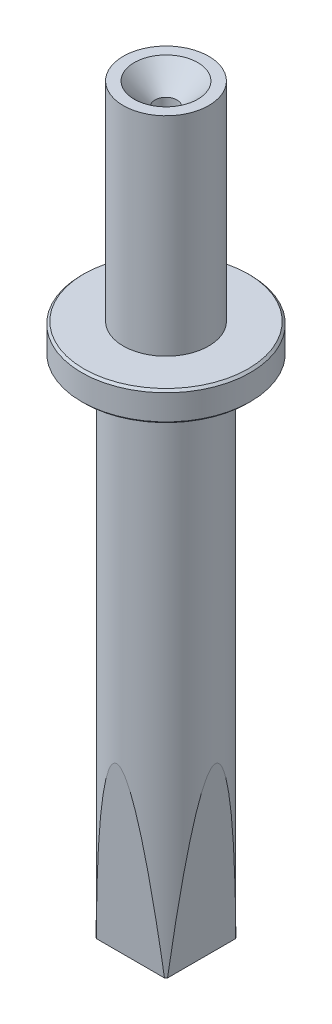
ISO-10303-21;
HEADER;
FILE_DESCRIPTION(('STEP AP214'),'2;1');
FILE_NAME('part.step','',(''),(''),'','','');
FILE_SCHEMA(('AUTOMOTIVE_DESIGN { 1 0 10303 214 1 1 1 1 }'));
ENDSEC;
DATA;
#1=APPLICATION_CONTEXT('core data for automotive mechanical design processes');
#2=APPLICATION_PROTOCOL_DEFINITION('international standard','automotive_design',2000,#1);
#3=PRODUCT_CONTEXT('',#1,'mechanical');
#4=PRODUCT('Part','Part','',(#3));
#5=PRODUCT_RELATED_PRODUCT_CATEGORY('part','',(#4));
#6=PRODUCT_DEFINITION_FORMATION('','',#4);
#7=PRODUCT_DEFINITION_CONTEXT('part definition',#1,'design');
#8=PRODUCT_DEFINITION('design','',#6,#7);
#9=PRODUCT_DEFINITION_SHAPE('','',#8);
#10=(LENGTH_UNIT() NAMED_UNIT(*) SI_UNIT(.MILLI.,.METRE.));
#11=(NAMED_UNIT(*) PLANE_ANGLE_UNIT() SI_UNIT($,.RADIAN.));
#12=(NAMED_UNIT(*) SI_UNIT($,.STERADIAN.) SOLID_ANGLE_UNIT());
#13=UNCERTAINTY_MEASURE_WITH_UNIT(LENGTH_MEASURE(1.E-05),#10,'distance_accuracy_value','');
#14=(GEOMETRIC_REPRESENTATION_CONTEXT(3) GLOBAL_UNCERTAINTY_ASSIGNED_CONTEXT((#13)) GLOBAL_UNIT_ASSIGNED_CONTEXT((#10,
#11,#12)) REPRESENTATION_CONTEXT('',''));
#15=CARTESIAN_POINT('',(0.,0.,0.));
#16=DIRECTION('',(0.,0.,1.));
#17=DIRECTION('',(1.,0.,0.));
#18=AXIS2_PLACEMENT_3D('',#15,#16,#17);
#19=CARTESIAN_POINT('',(0.,-30.0308657865101,0.));
#20=DIRECTION('',(0.,1.,0.));
#21=DIRECTION('',(0.,0.,1.));
#22=AXIS2_PLACEMENT_3D('',#19,#20,#21);
#23=CYLINDRICAL_SURFACE('',#22,3.9);
#24=CARTESIAN_POINT('',(0.,-19.,0.));
#25=DIRECTION('',(0.,1.,0.));
#26=DIRECTION('',(0.,0.,1.));
#27=AXIS2_PLACEMENT_3D('',#24,#25,#26);
#28=CIRCLE('',#27,3.9);
#29=CARTESIAN_POINT('',(0.,-19.,3.9));
#30=VERTEX_POINT('',#29);
#31=EDGE_CURVE('E127',#30,#30,#28,.F.);
#32=ORIENTED_EDGE('',*,*,#31,.F.);
#33=EDGE_LOOP('',(#32));
#34=FACE_BOUND('',#33,.T.);
#35=CARTESIAN_POINT('',(0.,0.,0.));
#36=DIRECTION('',(0.,1.,0.));
#37=DIRECTION('',(0.,0.,1.));
#38=AXIS2_PLACEMENT_3D('',#35,#36,#37);
#39=CIRCLE('',#38,3.9);
#40=CARTESIAN_POINT('',(0.,0.,3.9));
#41=VERTEX_POINT('',#40);
#42=EDGE_CURVE('E113',#41,#41,#39,.T.);
#43=ORIENTED_EDGE('',*,*,#42,.F.);
#44=EDGE_LOOP('',(#43));
#45=FACE_BOUND('',#44,.T.);
#46=ADVANCED_FACE('F45',(#34,#45),#23,.T.);
#47=CARTESIAN_POINT('',(0.,0.,0.));
#48=DIRECTION('',(0.,1.,0.));
#49=DIRECTION('',(0.,0.,1.));
#50=AXIS2_PLACEMENT_3D('',#47,#48,#49);
#51=PLANE('',#50);
#52=CARTESIAN_POINT('',(0.,0.,0.));
#53=DIRECTION('',(0.,1.,0.));
#54=DIRECTION('',(0.,0.,1.));
#55=AXIS2_PLACEMENT_3D('',#52,#53,#54);
#56=CIRCLE('',#55,2.9);
#57=CARTESIAN_POINT('',(0.,0.,2.9));
#58=VERTEX_POINT('',#57);
#59=EDGE_CURVE('E138',#58,#58,#56,.T.);
#60=ORIENTED_EDGE('',*,*,#59,.F.);
#61=EDGE_LOOP('',(#60));
#62=FACE_BOUND('',#61,.T.);
#63=ORIENTED_EDGE('',*,*,#42,.T.);
#64=EDGE_LOOP('',(#63));
#65=FACE_BOUND('',#64,.T.);
#66=ADVANCED_FACE('F145',(#62,#65),#51,.T.);
#67=CARTESIAN_POINT('',(0.,-21.7,0.));
#68=DIRECTION('',(0.,1.,0.));
#69=DIRECTION('',(0.,0.,1.));
#70=AXIS2_PLACEMENT_3D('',#67,#68,#69);
#71=CYLINDRICAL_SURFACE('',#70,7.7);
#72=CARTESIAN_POINT('',(0.,-21.5,0.));
#73=DIRECTION('',(0.,1.,0.));
#74=DIRECTION('',(0.,0.,1.));
#75=AXIS2_PLACEMENT_3D('',#72,#73,#74);
#76=CIRCLE('',#75,7.7);
#77=CARTESIAN_POINT('',(0.,-21.5,7.7));
#78=VERTEX_POINT('',#77);
#79=EDGE_CURVE('E179',#78,#78,#76,.T.);
#80=CARTESIAN_POINT('',(0.,-19.2,0.));
#81=DIRECTION('',(0.,1.,0.));
#82=DIRECTION('',(0.,0.,1.));
#83=AXIS2_PLACEMENT_3D('',#80,#81,#82);
#84=CIRCLE('',#83,7.7);
#85=CARTESIAN_POINT('',(0.,-19.2,7.7));
#86=VERTEX_POINT('',#85);
#87=EDGE_CURVE('E133',#86,#86,#84,.F.);
#88=CARTESIAN_POINT('',(0.,-21.5,7.7));
#89=CARTESIAN_POINT('',(0.,-21.4760416666666,7.7));
#90=CARTESIAN_POINT('',(0.,-21.4520833333333,7.7));
#91=CARTESIAN_POINT('',(0.,-21.4041666666666,7.7));
#92=CARTESIAN_POINT('',(0.,-21.3802083333333,7.7));
#93=CARTESIAN_POINT('',(0.,-21.3322916666666,7.7));
#94=CARTESIAN_POINT('',(0.,-21.3083333333333,7.7));
#95=CARTESIAN_POINT('',(0.,-21.2604166666666,7.7));
#96=CARTESIAN_POINT('',(0.,-21.2364583333333,7.7));
#97=CARTESIAN_POINT('',(0.,-21.1885416666666,7.7));
#98=CARTESIAN_POINT('',(0.,-21.1645833333333,7.7));
#99=CARTESIAN_POINT('',(0.,-21.1166666666666,7.7));
#100=CARTESIAN_POINT('',(0.,-21.0927083333333,7.7));
#101=CARTESIAN_POINT('',(0.,-21.0447916666666,7.7));
#102=CARTESIAN_POINT('',(0.,-21.0208333333333,7.7));
#103=CARTESIAN_POINT('',(0.,-20.9729166666666,7.7));
#104=CARTESIAN_POINT('',(0.,-20.9489583333333,7.7));
#105=CARTESIAN_POINT('',(0.,-20.9010416666666,7.7));
#106=CARTESIAN_POINT('',(0.,-20.8770833333333,7.7));
#107=CARTESIAN_POINT('',(0.,-20.8291666666666,7.7));
#108=CARTESIAN_POINT('',(0.,-20.8052083333333,7.7));
#109=CARTESIAN_POINT('',(0.,-20.7572916666666,7.7));
#110=CARTESIAN_POINT('',(0.,-20.7333333333333,7.7));
#111=CARTESIAN_POINT('',(0.,-20.6854166666666,7.7));
#112=CARTESIAN_POINT('',(0.,-20.6614583333333,7.7));
#113=CARTESIAN_POINT('',(0.,-20.6135416666666,7.7));
#114=CARTESIAN_POINT('',(0.,-20.5895833333333,7.7));
#115=CARTESIAN_POINT('',(0.,-20.5416666666666,7.7));
#116=CARTESIAN_POINT('',(0.,-20.5177083333333,7.7));
#117=CARTESIAN_POINT('',(0.,-20.4697916666666,7.7));
#118=CARTESIAN_POINT('',(0.,-20.4458333333333,7.7));
#119=CARTESIAN_POINT('',(0.,-20.3979166666666,7.7));
#120=CARTESIAN_POINT('',(0.,-20.3739583333333,7.7));
#121=CARTESIAN_POINT('',(0.,-20.3260416666666,7.7));
#122=CARTESIAN_POINT('',(0.,-20.3020833333333,7.7));
#123=CARTESIAN_POINT('',(0.,-20.2541666666666,7.7));
#124=CARTESIAN_POINT('',(0.,-20.2302083333333,7.7));
#125=CARTESIAN_POINT('',(0.,-20.1822916666666,7.7));
#126=CARTESIAN_POINT('',(0.,-20.1583333333333,7.7));
#127=CARTESIAN_POINT('',(0.,-20.1104166666666,7.7));
#128=CARTESIAN_POINT('',(0.,-20.0864583333333,7.7));
#129=CARTESIAN_POINT('',(0.,-20.0385416666666,7.7));
#130=CARTESIAN_POINT('',(0.,-20.0145833333333,7.7));
#131=CARTESIAN_POINT('',(0.,-19.9666666666666,7.7));
#132=CARTESIAN_POINT('',(0.,-19.9427083333333,7.7));
#133=CARTESIAN_POINT('',(0.,-19.8947916666666,7.7));
#134=CARTESIAN_POINT('',(0.,-19.8708333333333,7.7));
#135=CARTESIAN_POINT('',(0.,-19.8229166666666,7.7));
#136=CARTESIAN_POINT('',(0.,-19.7989583333333,7.7));
#137=CARTESIAN_POINT('',(0.,-19.7510416666666,7.7));
#138=CARTESIAN_POINT('',(0.,-19.7270833333333,7.7));
#139=CARTESIAN_POINT('',(0.,-19.6791666666666,7.7));
#140=CARTESIAN_POINT('',(0.,-19.6552083333333,7.7));
#141=CARTESIAN_POINT('',(0.,-19.6072916666666,7.7));
#142=CARTESIAN_POINT('',(0.,-19.5833333333333,7.7));
#143=CARTESIAN_POINT('',(0.,-19.5354166666666,7.7));
#144=CARTESIAN_POINT('',(0.,-19.5114583333333,7.7));
#145=CARTESIAN_POINT('',(0.,-19.4635416666666,7.7));
#146=CARTESIAN_POINT('',(0.,-19.4395833333333,7.7));
#147=CARTESIAN_POINT('',(0.,-19.3916666666666,7.7));
#148=CARTESIAN_POINT('',(0.,-19.3677083333333,7.7));
#149=CARTESIAN_POINT('',(0.,-19.3197916666666,7.7));
#150=CARTESIAN_POINT('',(0.,-19.2958333333333,7.7));
#151=CARTESIAN_POINT('',(0.,-19.2479166666666,7.7));
#152=CARTESIAN_POINT('',(0.,-19.2239583333333,7.7));
#153=CARTESIAN_POINT('',(0.,-19.2,7.7));
#154=B_SPLINE_CURVE_WITH_KNOTS('',3,(#88,#89,#90,#91,#92,#93,#94,#95,#96,#97,#98,#99,#100,#101,
#102,#103,#104,#105,#106,#107,#108,#109,#110,#111,#112,#113,#114,#115,#116,#117,#118,#119,#120,
#121,#122,#123,#124,#125,#126,#127,#128,#129,#130,#131,#132,#133,#134,#135,#136,#137,#138,#139,
#140,#141,#142,#143,#144,#145,#146,#147,#148,#149,#150,#151,#152,#153),.UNSPECIFIED.,.F.,.F.,(4,
2,2,2,2,2,2,2,2,2,2,2,2,2,2,2,2,2,2,2,2,2,2,2,2,2,2,2,2,2,2,2,4),(0.,0.071874999999999,
0.143749999999998,0.215624999999997,0.2875,0.359374999999999,0.431249999999998,
0.503124999999997,0.574999999999999,0.646874999999998,0.718749999999997,0.790625,
0.862499999999999,0.934374999999998,1.00625,1.078125,1.15,1.221875,1.29375,1.365625,1.4375,
1.509375,1.58125,1.653125,1.725,1.796875,1.86875,1.940625,2.0125,2.084375,2.15625,2.228125,2.3),.UNSPECIFIED.);
#155=EDGE_CURVE('BSEAM155',#78,#86,#154,.T.);
#156=ORIENTED_EDGE('',*,*,#79,.T.);
#157=ORIENTED_EDGE('',*,*,#87,.T.);
#158=ORIENTED_EDGE('',*,*,#155,.T.);
#159=ORIENTED_EDGE('',*,*,#155,.F.);
#160=EDGE_LOOP('',(#156,#158,#157,#159));
#161=FACE_BOUND('',#160,.T.);
#162=ADVANCED_FACE('F155',(#161),#71,.T.);
#163=CARTESIAN_POINT('',(0.,-21.7,0.));
#164=DIRECTION('',(0.,1.,0.));
#165=DIRECTION('',(0.,0.,1.));
#166=AXIS2_PLACEMENT_3D('',#163,#164,#165);
#167=PLANE('',#166);
#168=CARTESIAN_POINT('',(0.,-21.7,0.));
#169=DIRECTION('',(0.,1.,0.));
#170=DIRECTION('',(0.,0.,1.));
#171=AXIS2_PLACEMENT_3D('',#168,#169,#170);
#172=CIRCLE('',#171,7.49999999999998);
#173=CARTESIAN_POINT('',(0.,-21.7,7.49999999999998));
#174=VERTEX_POINT('',#173);
#175=EDGE_CURVE('E54',#174,#174,#172,.F.);
#176=ORIENTED_EDGE('',*,*,#175,.T.);
#177=EDGE_LOOP('',(#176));
#178=FACE_BOUND('',#177,.T.);
#179=CARTESIAN_POINT('',(0.,-21.7,0.));
#180=DIRECTION('',(0.,-1.,0.));
#181=DIRECTION('',(0.,0.,-1.));
#182=AXIS2_PLACEMENT_3D('',#179,#180,#181);
#183=CIRCLE('',#182,3.7);
#184=CARTESIAN_POINT('',(0.,-21.7,-3.7));
#185=VERTEX_POINT('',#184);
#186=EDGE_CURVE('E124',#185,#185,#183,.T.);
#187=ORIENTED_EDGE('',*,*,#186,.F.);
#188=EDGE_LOOP('',(#187));
#189=FACE_BOUND('',#188,.T.);
#190=ADVANCED_FACE('F270',(#178,#189),#167,.F.);
#191=CARTESIAN_POINT('',(0.,-19.,0.));
#192=DIRECTION('',(0.,1.,0.));
#193=DIRECTION('',(0.,0.,1.));
#194=AXIS2_PLACEMENT_3D('',#191,#192,#193);
#195=PLANE('',#194);
#196=CARTESIAN_POINT('',(0.,-19.,0.));
#197=DIRECTION('',(0.,1.,0.));
#198=DIRECTION('',(0.,0.,1.));
#199=AXIS2_PLACEMENT_3D('',#196,#197,#198);
#200=CIRCLE('',#199,7.50000000000003);
#201=CARTESIAN_POINT('',(0.,-19.,7.50000000000003));
#202=VERTEX_POINT('',#201);
#203=EDGE_CURVE('E12',#202,#202,#200,.T.);
#204=ORIENTED_EDGE('',*,*,#203,.T.);
#205=EDGE_LOOP('',(#204));
#206=FACE_BOUND('',#205,.T.);
#207=ORIENTED_EDGE('',*,*,#31,.T.);
#208=EDGE_LOOP('',(#207));
#209=FACE_BOUND('',#208,.T.);
#210=ADVANCED_FACE('F268',(#206,#209),#195,.T.);
#211=CARTESIAN_POINT('',(0.,-22.7,0.));
#212=DIRECTION('',(0.,1.,0.));
#213=DIRECTION('',(0.,0.,1.));
#214=AXIS2_PLACEMENT_3D('',#211,#212,#213);
#215=CYLINDRICAL_SURFACE('',#214,3.7);
#216=CARTESIAN_POINT('',(0.,-22.7,0.));
#217=DIRECTION('',(0.,-1.,0.));
#218=DIRECTION('',(0.,0.,-1.));
#219=AXIS2_PLACEMENT_3D('',#216,#217,#218);
#220=CIRCLE('',#219,3.7);
#221=CARTESIAN_POINT('',(0.,-22.7,-3.7));
#222=VERTEX_POINT('',#221);
#223=EDGE_CURVE('E109',#222,#222,#220,.T.);
#224=ORIENTED_EDGE('',*,*,#223,.F.);
#225=EDGE_LOOP('',(#224));
#226=FACE_BOUND('',#225,.T.);
#227=ORIENTED_EDGE('',*,*,#186,.T.);
#228=EDGE_LOOP('',(#227));
#229=FACE_BOUND('',#228,.T.);
#230=ADVANCED_FACE('F265',(#226,#229),#215,.T.);
#231=CARTESIAN_POINT('',(0.,-67.7,0.));
#232=DIRECTION('',(0.,1.,0.));
#233=DIRECTION('',(0.,0.,1.));
#234=AXIS2_PLACEMENT_3D('',#231,#232,#233);
#235=CYLINDRICAL_SURFACE('',#234,4.5);
#236=CARTESIAN_POINT('',(0.,-67.7,0.));
#237=DIRECTION('',(0.,-1.,0.));
#238=DIRECTION('',(0.,0.,-1.));
#239=AXIS2_PLACEMENT_3D('',#236,#237,#238);
#240=CIRCLE('',#239,4.5);
#241=CARTESIAN_POINT('',(-3.11247489949719,-67.7,3.24999999999999));
#242=VERTEX_POINT('',#241);
#243=CARTESIAN_POINT('',(-3.25,-67.7,3.11247489949718));
#244=VERTEX_POINT('',#243);
#245=EDGE_CURVE('E102',#242,#244,#240,.T.);
#246=ORIENTED_EDGE('',*,*,#245,.F.);
#247=CARTESIAN_POINT('',(0.,-109.3,0.));
#248=DIRECTION('',(0.,0.0778876672929096,-0.996962141349243));
#249=DIRECTION('',(0.,0.996962141349244,0.0778876672929097));
#250=AXIS2_PLACEMENT_3D('',#247,#248,#249);
#251=ELLIPSE('',#250,57.7755138445345,4.5);
#252=CARTESIAN_POINT('',(3.11247489949717,-67.7,3.25000000000001));
#253=VERTEX_POINT('',#252);
#254=EDGE_CURVE('E89',#242,#253,#251,.T.);
#255=ORIENTED_EDGE('',*,*,#254,.T.);
#256=CARTESIAN_POINT('',(3.25,-67.7,3.11247489949718));
#257=VERTEX_POINT('',#256);
#258=EDGE_CURVE('E101',#257,#253,#240,.T.);
#259=ORIENTED_EDGE('',*,*,#258,.F.);
#260=CARTESIAN_POINT('',(0.,-109.3,0.));
#261=DIRECTION('',(-0.996962141349243,0.0778876672929096,0.));
#262=DIRECTION('',(0.0778876672929097,0.996962141349244,0.));
#263=AXIS2_PLACEMENT_3D('',#260,#261,#262);
#264=ELLIPSE('',#263,57.7755138445345,4.5);
#265=CARTESIAN_POINT('',(3.25,-67.7,-3.11247489949718));
#266=VERTEX_POINT('',#265);
#267=EDGE_CURVE('E94',#257,#266,#264,.T.);
#268=ORIENTED_EDGE('',*,*,#267,.T.);
#269=CARTESIAN_POINT('',(3.11247489949722,-67.7,-3.24999999999997));
#270=VERTEX_POINT('',#269);
#271=EDGE_CURVE('E111',#270,#266,#240,.T.);
#272=ORIENTED_EDGE('',*,*,#271,.F.);
#273=CARTESIAN_POINT('',(0.,-109.3,0.));
#274=DIRECTION('',(0.,0.0778876672929096,0.996962141349243));
#275=DIRECTION('',(0.,0.996962141349244,-0.0778876672929097));
#276=AXIS2_PLACEMENT_3D('',#273,#274,#275);
#277=ELLIPSE('',#276,57.7755138445345,4.5);
#278=CARTESIAN_POINT('',(-3.11247489949715,-67.7,-3.25000000000003));
#279=VERTEX_POINT('',#278);
#280=EDGE_CURVE('E60',#270,#279,#277,.T.);
#281=ORIENTED_EDGE('',*,*,#280,.T.);
#282=CARTESIAN_POINT('',(-3.25,-67.7,-3.11247489949718));
#283=VERTEX_POINT('',#282);
#284=EDGE_CURVE('E115',#283,#279,#240,.T.);
#285=ORIENTED_EDGE('',*,*,#284,.F.);
#286=CARTESIAN_POINT('',(0.,-109.3,0.));
#287=DIRECTION('',(0.996962141349243,0.0778876672929096,0.));
#288=DIRECTION('',(-0.0778876672929097,0.996962141349244,0.));
#289=AXIS2_PLACEMENT_3D('',#286,#287,#288);
#290=ELLIPSE('',#289,57.7755138445345,4.5);
#291=EDGE_CURVE('E67',#283,#244,#290,.T.);
#292=ORIENTED_EDGE('',*,*,#291,.T.);
#293=EDGE_LOOP('',(#246,#255,#259,#268,#272,#281,#285,#292));
#294=FACE_BOUND('',#293,.T.);
#295=CARTESIAN_POINT('',(0.,-22.7,0.));
#296=DIRECTION('',(0.,-1.,0.));
#297=DIRECTION('',(0.,0.,-1.));
#298=AXIS2_PLACEMENT_3D('',#295,#296,#297);
#299=CIRCLE('',#298,4.5);
#300=CARTESIAN_POINT('',(0.,-22.7,-4.5));
#301=VERTEX_POINT('',#300);
#302=EDGE_CURVE('E118',#301,#301,#299,.T.);
#303=ORIENTED_EDGE('',*,*,#302,.T.);
#304=EDGE_LOOP('',(#303));
#305=FACE_BOUND('',#304,.T.);
#306=ADVANCED_FACE('F98',(#294,#305),#235,.T.);
#307=CARTESIAN_POINT('',(0.,-67.7,0.));
#308=DIRECTION('',(0.,-1.,0.));
#309=DIRECTION('',(0.,0.,-1.));
#310=AXIS2_PLACEMENT_3D('',#307,#308,#309);
#311=PLANE('',#310);
#312=CARTESIAN_POINT('',(0.,-67.7,0.));
#313=DIRECTION('',(0.,-1.,0.));
#314=DIRECTION('',(0.,0.,-1.));
#315=AXIS2_PLACEMENT_3D('',#312,#313,#314);
#316=CIRCLE('',#315,3.15);
#317=CARTESIAN_POINT('',(0.,-67.7,-3.15));
#318=VERTEX_POINT('',#317);
#319=EDGE_CURVE('E228',#318,#318,#316,.T.);
#320=ORIENTED_EDGE('',*,*,#319,.F.);
#321=EDGE_LOOP('',(#320));
#322=FACE_BOUND('',#321,.T.);
#323=DIRECTION('',(1.,0.,0.));
#324=VECTOR('',#323,1.);
#325=CARTESIAN_POINT('',(0.,-67.7,3.25));
#326=LINE('',#325,#324);
#327=EDGE_CURVE('E86',#242,#253,#326,.T.);
#328=ORIENTED_EDGE('',*,*,#327,.F.);
#329=ORIENTED_EDGE('',*,*,#245,.T.);
#330=DIRECTION('',(0.,0.,1.));
#331=VECTOR('',#330,1.);
#332=CARTESIAN_POINT('',(-3.25,-67.7,0.));
#333=LINE('',#332,#331);
#334=EDGE_CURVE('E103',#283,#244,#333,.T.);
#335=ORIENTED_EDGE('',*,*,#334,.F.);
#336=ORIENTED_EDGE('',*,*,#284,.T.);
#337=DIRECTION('',(-1.,0.,0.));
#338=VECTOR('',#337,1.);
#339=CARTESIAN_POINT('',(0.,-67.7,-3.25));
#340=LINE('',#339,#338);
#341=EDGE_CURVE('E235',#270,#279,#340,.T.);
#342=ORIENTED_EDGE('',*,*,#341,.F.);
#343=ORIENTED_EDGE('',*,*,#271,.T.);
#344=DIRECTION('',(0.,0.,-1.));
#345=VECTOR('',#344,1.);
#346=CARTESIAN_POINT('',(3.25,-67.7,0.));
#347=LINE('',#346,#345);
#348=EDGE_CURVE('E108',#257,#266,#347,.T.);
#349=ORIENTED_EDGE('',*,*,#348,.F.);
#350=ORIENTED_EDGE('',*,*,#258,.T.);
#351=EDGE_LOOP('',(#328,#329,#335,#336,#342,#343,#349,#350));
#352=FACE_BOUND('',#351,.T.);
#353=ADVANCED_FACE('F106',(#322,#352),#311,.T.);
#354=CARTESIAN_POINT('',(0.,-22.7,0.));
#355=DIRECTION('',(0.,-1.,0.));
#356=DIRECTION('',(0.,0.,-1.));
#357=AXIS2_PLACEMENT_3D('',#354,#355,#356);
#358=PLANE('',#357);
#359=ORIENTED_EDGE('',*,*,#223,.T.);
#360=EDGE_LOOP('',(#359));
#361=FACE_BOUND('',#360,.T.);
#362=ORIENTED_EDGE('',*,*,#302,.F.);
#363=EDGE_LOOP('',(#362));
#364=FACE_BOUND('',#363,.T.);
#365=ADVANCED_FACE('F255',(#361,#364),#358,.F.);
#366=CARTESIAN_POINT('',(4.5,-51.7,-14.75));
#367=DIRECTION('',(-0.996962141349243,0.0778876672929096,0.));
#368=DIRECTION('',(-0.0778876672929097,-0.996962141349244,0.));
#369=AXIS2_PLACEMENT_3D('',#366,#367,#368);
#370=PLANE('',#369);
#371=ORIENTED_EDGE('',*,*,#267,.F.);
#372=ORIENTED_EDGE('',*,*,#348,.T.);
#373=EDGE_LOOP('',(#371,#372));
#374=FACE_BOUND('',#373,.T.);
#375=ADVANCED_FACE('F249',(#374),#370,.F.);
#376=CARTESIAN_POINT('',(-14.75,-51.7,-4.50000000000015));
#377=DIRECTION('',(0.,0.0778876672929096,0.996962141349243));
#378=DIRECTION('',(0.,-0.996962141349244,0.0778876672929097));
#379=AXIS2_PLACEMENT_3D('',#376,#377,#378);
#380=PLANE('',#379);
#381=ORIENTED_EDGE('',*,*,#280,.F.);
#382=ORIENTED_EDGE('',*,*,#341,.T.);
#383=EDGE_LOOP('',(#381,#382));
#384=FACE_BOUND('',#383,.T.);
#385=ADVANCED_FACE('F238',(#384),#380,.F.);
#386=CARTESIAN_POINT('',(-4.5,-51.7,14.75));
#387=DIRECTION('',(0.996962141349243,0.0778876672929096,0.));
#388=DIRECTION('',(0.0778876672929097,-0.996962141349244,0.));
#389=AXIS2_PLACEMENT_3D('',#386,#387,#388);
#390=PLANE('',#389);
#391=ORIENTED_EDGE('',*,*,#291,.F.);
#392=ORIENTED_EDGE('',*,*,#334,.T.);
#393=EDGE_LOOP('',(#391,#392));
#394=FACE_BOUND('',#393,.T.);
#395=ADVANCED_FACE('F240',(#394),#390,.F.);
#396=CARTESIAN_POINT('',(14.75,-51.7,4.50000000000005));
#397=DIRECTION('',(0.,0.0778876672929096,-0.996962141349243));
#398=DIRECTION('',(0.,-0.996962141349244,-0.0778876672929097));
#399=AXIS2_PLACEMENT_3D('',#396,#397,#398);
#400=PLANE('',#399);
#401=ORIENTED_EDGE('',*,*,#254,.F.);
#402=ORIENTED_EDGE('',*,*,#327,.T.);
#403=EDGE_LOOP('',(#401,#402));
#404=FACE_BOUND('',#403,.T.);
#405=ADVANCED_FACE('F88',(#404),#400,.F.);
#406=CARTESIAN_POINT('',(0.,-63.7,0.));
#407=DIRECTION('',(0.,-1.,0.));
#408=DIRECTION('',(0.,0.,-1.));
#409=AXIS2_PLACEMENT_3D('',#406,#407,#408);
#410=CYLINDRICAL_SURFACE('',#409,3.15);
#411=CARTESIAN_POINT('',(0.,-63.7,0.));
#412=DIRECTION('',(0.,-1.,0.));
#413=DIRECTION('',(0.,0.,-1.));
#414=AXIS2_PLACEMENT_3D('',#411,#412,#413);
#415=CIRCLE('',#414,3.15);
#416=CARTESIAN_POINT('',(0.,-63.7,-3.15));
#417=VERTEX_POINT('',#416);
#418=EDGE_CURVE('E229',#417,#417,#415,.T.);
#419=ORIENTED_EDGE('',*,*,#418,.F.);
#420=EDGE_LOOP('',(#419));
#421=FACE_BOUND('',#420,.T.);
#422=ORIENTED_EDGE('',*,*,#319,.T.);
#423=EDGE_LOOP('',(#422));
#424=FACE_BOUND('',#423,.T.);
#425=ADVANCED_FACE('F247',(#421,#424),#410,.F.);
#426=CARTESIAN_POINT('',(0.,-63.7,0.));
#427=DIRECTION('',(0.,-1.,0.));
#428=DIRECTION('',(0.,0.,-1.));
#429=AXIS2_PLACEMENT_3D('',#426,#427,#428);
#430=PLANE('',#429);
#431=CARTESIAN_POINT('',(0.,-63.7,0.));
#432=DIRECTION('',(0.,-1.,0.));
#433=DIRECTION('',(0.,0.,-1.));
#434=AXIS2_PLACEMENT_3D('',#431,#432,#433);
#435=CIRCLE('',#434,2.65);
#436=CARTESIAN_POINT('',(0.,-63.7,-2.65));
#437=VERTEX_POINT('',#436);
#438=EDGE_CURVE('E219',#437,#437,#435,.T.);
#439=ORIENTED_EDGE('',*,*,#438,.F.);
#440=EDGE_LOOP('',(#439));
#441=FACE_BOUND('',#440,.T.);
#442=ORIENTED_EDGE('',*,*,#418,.T.);
#443=EDGE_LOOP('',(#442));
#444=FACE_BOUND('',#443,.T.);
#445=ADVANCED_FACE('F331',(#441,#444),#430,.T.);
#446=CARTESIAN_POINT('',(0.,-44.2046681194226,0.));
#447=DIRECTION('',(0.,-1.,0.));
#448=DIRECTION('',(0.,0.,-1.));
#449=AXIS2_PLACEMENT_3D('',#446,#447,#448);
#450=CYLINDRICAL_SURFACE('',#449,2.65);
#451=CARTESIAN_POINT('',(0.,-51.7,0.));
#452=DIRECTION('',(0.,-1.,0.));
#453=DIRECTION('',(0.,0.,-1.));
#454=AXIS2_PLACEMENT_3D('',#451,#452,#453);
#455=CIRCLE('',#454,2.65);
#456=CARTESIAN_POINT('',(0.,-51.7,-2.65));
#457=VERTEX_POINT('',#456);
#458=EDGE_CURVE('E225',#457,#457,#455,.F.);
#459=ORIENTED_EDGE('',*,*,#458,.T.);
#460=EDGE_LOOP('',(#459));
#461=FACE_BOUND('',#460,.T.);
#462=ORIENTED_EDGE('',*,*,#438,.T.);
#463=EDGE_LOOP('',(#462));
#464=FACE_BOUND('',#463,.T.);
#465=ADVANCED_FACE('F337',(#461,#464),#450,.F.);
#466=CARTESIAN_POINT('',(0.,-51.7,0.));
#467=DIRECTION('',(0.,-1.,0.));
#468=DIRECTION('',(0.,0.,-1.));
#469=AXIS2_PLACEMENT_3D('',#466,#467,#468);
#470=PLANE('',#469);
#471=ORIENTED_EDGE('',*,*,#458,.F.);
#472=EDGE_LOOP('',(#471));
#473=FACE_BOUND('',#472,.T.);
#474=ADVANCED_FACE('F200',(#473),#470,.T.);
#475=CARTESIAN_POINT('',(0.,-2.,0.));
#476=DIRECTION('',(0.,1.,0.));
#477=DIRECTION('',(0.,0.,1.));
#478=AXIS2_PLACEMENT_3D('',#475,#476,#477);
#479=CONICAL_SURFACE('',#478,1.,0.759762754875771);
#480=CARTESIAN_POINT('',(0.,-2.,0.));
#481=DIRECTION('',(0.,1.,0.));
#482=DIRECTION('',(0.,0.,1.));
#483=AXIS2_PLACEMENT_3D('',#480,#481,#482);
#484=CIRCLE('',#483,1.);
#485=CARTESIAN_POINT('',(0.,-2.,1.));
#486=VERTEX_POINT('',#485);
#487=EDGE_CURVE('E446',#486,#486,#484,.T.);
#488=ORIENTED_EDGE('',*,*,#487,.F.);
#489=EDGE_LOOP('',(#488));
#490=FACE_BOUND('',#489,.T.);
#491=ORIENTED_EDGE('',*,*,#59,.T.);
#492=EDGE_LOOP('',(#491));
#493=FACE_BOUND('',#492,.T.);
#494=ADVANCED_FACE('F195',(#490,#493),#479,.F.);
#495=CARTESIAN_POINT('',(0.,-5.,0.));
#496=DIRECTION('',(0.,1.,0.));
#497=DIRECTION('',(0.,0.,1.));
#498=AXIS2_PLACEMENT_3D('',#495,#496,#497);
#499=CYLINDRICAL_SURFACE('',#498,1.);
#500=CARTESIAN_POINT('',(0.,-5.,0.));
#501=DIRECTION('',(0.,1.,0.));
#502=DIRECTION('',(0.,0.,1.));
#503=AXIS2_PLACEMENT_3D('',#500,#501,#502);
#504=CIRCLE('',#503,1.);
#505=CARTESIAN_POINT('',(0.,-5.,1.));
#506=VERTEX_POINT('',#505);
#507=EDGE_CURVE('E220',#506,#506,#504,.T.);
#508=ORIENTED_EDGE('',*,*,#507,.F.);
#509=EDGE_LOOP('',(#508));
#510=FACE_BOUND('',#509,.T.);
#511=ORIENTED_EDGE('',*,*,#487,.T.);
#512=EDGE_LOOP('',(#511));
#513=FACE_BOUND('',#512,.T.);
#514=ADVANCED_FACE('F171',(#510,#513),#499,.F.);
#515=CARTESIAN_POINT('',(0.,-5.,0.));
#516=DIRECTION('',(0.,1.,0.));
#517=DIRECTION('',(0.,0.,1.));
#518=AXIS2_PLACEMENT_3D('',#515,#516,#517);
#519=PLANE('',#518);
#520=ORIENTED_EDGE('',*,*,#507,.T.);
#521=EDGE_LOOP('',(#520));
#522=FACE_BOUND('',#521,.T.);
#523=ADVANCED_FACE('F164',(#522),#519,.T.);
#524=CARTESIAN_POINT('',(0.,-21.5,0.));
#525=DIRECTION('',(0.,1.,0.));
#526=DIRECTION('',(0.,0.,1.));
#527=AXIS2_PLACEMENT_3D('',#524,#525,#526);
#528=CONICAL_SURFACE('',#527,7.7,0.785398163397438);
#529=CARTESIAN_POINT('',(0.,-21.7,7.49999999999998));
#530=CARTESIAN_POINT('',(0.,-21.6979166666667,7.50208333333331));
#531=CARTESIAN_POINT('',(0.,-21.6958333333333,7.50416666666664));
#532=CARTESIAN_POINT('',(0.,-21.6916666666667,7.50833333333331));
#533=CARTESIAN_POINT('',(0.,-21.6895833333333,7.51041666666664));
#534=CARTESIAN_POINT('',(0.,-21.6854166666667,7.51458333333331));
#535=CARTESIAN_POINT('',(0.,-21.6833333333333,7.51666666666664));
#536=CARTESIAN_POINT('',(0.,-21.6791666666667,7.52083333333331));
#537=CARTESIAN_POINT('',(0.,-21.6770833333333,7.52291666666665));
#538=CARTESIAN_POINT('',(0.,-21.6729166666667,7.52708333333331));
#539=CARTESIAN_POINT('',(0.,-21.6708333333333,7.52916666666665));
#540=CARTESIAN_POINT('',(0.,-21.6666666666667,7.53333333333331));
#541=CARTESIAN_POINT('',(0.,-21.6645833333333,7.53541666666665));
#542=CARTESIAN_POINT('',(0.,-21.6604166666667,7.53958333333332));
#543=CARTESIAN_POINT('',(0.,-21.6583333333333,7.54166666666665));
#544=CARTESIAN_POINT('',(0.,-21.6541666666667,7.54583333333331));
#545=CARTESIAN_POINT('',(0.,-21.6520833333333,7.54791666666665));
#546=CARTESIAN_POINT('',(0.,-21.6479166666667,7.55208333333332));
#547=CARTESIAN_POINT('',(0.,-21.6458333333333,7.55416666666665));
#548=CARTESIAN_POINT('',(0.,-21.6416666666667,7.55833333333332));
#549=CARTESIAN_POINT('',(0.,-21.6395833333333,7.56041666666665));
#550=CARTESIAN_POINT('',(0.,-21.6354166666667,7.56458333333332));
#551=CARTESIAN_POINT('',(0.,-21.6333333333333,7.56666666666665));
#552=CARTESIAN_POINT('',(0.,-21.6291666666667,7.57083333333332));
#553=CARTESIAN_POINT('',(0.,-21.6270833333333,7.57291666666665));
#554=CARTESIAN_POINT('',(0.,-21.6229166666667,7.57708333333332));
#555=CARTESIAN_POINT('',(0.,-21.6208333333333,7.57916666666665));
#556=CARTESIAN_POINT('',(0.,-21.6166666666667,7.58333333333332));
#557=CARTESIAN_POINT('',(0.,-21.6145833333333,7.58541666666665));
#558=CARTESIAN_POINT('',(0.,-21.6104166666667,7.58958333333332));
#559=CARTESIAN_POINT('',(0.,-21.6083333333333,7.59166666666665));
#560=CARTESIAN_POINT('',(0.,-21.6041666666667,7.59583333333332));
#561=CARTESIAN_POINT('',(0.,-21.6020833333333,7.59791666666665));
#562=CARTESIAN_POINT('',(0.,-21.5979166666667,7.60208333333332));
#563=CARTESIAN_POINT('',(0.,-21.5958333333333,7.60416666666665));
#564=CARTESIAN_POINT('',(0.,-21.5916666666667,7.60833333333332));
#565=CARTESIAN_POINT('',(0.,-21.5895833333333,7.61041666666666));
#566=CARTESIAN_POINT('',(0.,-21.5854166666667,7.61458333333332));
#567=CARTESIAN_POINT('',(0.,-21.5833333333333,7.61666666666666));
#568=CARTESIAN_POINT('',(0.,-21.5791666666667,7.62083333333332));
#569=CARTESIAN_POINT('',(0.,-21.5770833333333,7.62291666666666));
#570=CARTESIAN_POINT('',(0.,-21.5729166666667,7.62708333333332));
#571=CARTESIAN_POINT('',(0.,-21.5708333333333,7.62916666666666));
#572=CARTESIAN_POINT('',(0.,-21.5666666666667,7.63333333333332));
#573=CARTESIAN_POINT('',(0.,-21.5645833333333,7.63541666666666));
#574=CARTESIAN_POINT('',(0.,-21.5604166666667,7.63958333333333));
#575=CARTESIAN_POINT('',(0.,-21.5583333333333,7.64166666666666));
#576=CARTESIAN_POINT('',(0.,-21.5541666666666,7.64583333333333));
#577=CARTESIAN_POINT('',(0.,-21.5520833333333,7.64791666666666));
#578=CARTESIAN_POINT('',(0.,-21.5479166666666,7.65208333333333));
#579=CARTESIAN_POINT('',(0.,-21.5458333333333,7.65416666666666));
#580=CARTESIAN_POINT('',(0.,-21.5416666666667,7.65833333333333));
#581=CARTESIAN_POINT('',(0.,-21.5395833333333,7.66041666666666));
#582=CARTESIAN_POINT('',(0.,-21.5354166666666,7.66458333333333));
#583=CARTESIAN_POINT('',(0.,-21.5333333333333,7.66666666666666));
#584=CARTESIAN_POINT('',(0.,-21.5291666666666,7.67083333333333));
#585=CARTESIAN_POINT('',(0.,-21.5270833333333,7.67291666666666));
#586=CARTESIAN_POINT('',(0.,-21.5229166666666,7.67708333333333));
#587=CARTESIAN_POINT('',(0.,-21.5208333333333,7.67916666666666));
#588=CARTESIAN_POINT('',(0.,-21.5166666666666,7.68333333333333));
#589=CARTESIAN_POINT('',(0.,-21.5145833333333,7.68541666666666));
#590=CARTESIAN_POINT('',(0.,-21.5104166666666,7.68958333333333));
#591=CARTESIAN_POINT('',(0.,-21.5083333333333,7.69166666666666));
#592=CARTESIAN_POINT('',(0.,-21.5041666666666,7.69583333333333));
#593=CARTESIAN_POINT('',(0.,-21.5020833333333,7.69791666666667));
#594=CARTESIAN_POINT('',(0.,-21.5,7.7));
#595=B_SPLINE_CURVE_WITH_KNOTS('',3,(#529,#530,#531,#532,#533,#534,#535,#536,#537,#538,#539,
#540,#541,#542,#543,#544,#545,#546,#547,#548,#549,#550,#551,#552,#553,#554,#555,#556,#557,#558,
#559,#560,#561,#562,#563,#564,#565,#566,#567,#568,#569,#570,#571,#572,#573,#574,#575,#576,#577,
#578,#579,#580,#581,#582,#583,#584,#585,#586,#587,#588,#589,#590,#591,#592,#593,#594),
.UNSPECIFIED.,.F.,.F.,(4,2,2,2,2,2,2,2,2,2,2,2,2,2,2,2,2,2,2,2,2,2,2,2,2,2,2,2,2,2,2,2,4),(0.,
0.0088388347648321,0.0176776695296636,0.0265165042944981,0.0353553390593296,0.0441941738241642,
0.0530330085889963,0.0618718433538302,0.0707106781186623,0.0795495128834938,0.0883883476483283,
0.0972271824131604,0.106066017177994,0.114904851942826,0.12374368670766,0.132582521472492,
0.141421356237326,0.150260191002159,0.159099025766991,0.167937860531825,0.176776695296657,
0.185615530061491,0.194454364826323,0.203293199591157,0.212132034355989,0.220970869120821,
0.229809703885655,0.238648538650487,0.247487373415321,0.256326208180153,0.265165042944987,
0.274003877709819,0.282842712474654),.UNSPECIFIED.);
#596=EDGE_CURVE('BSEAM160',#174,#78,#595,.T.);
#597=ORIENTED_EDGE('',*,*,#175,.F.);
#598=ORIENTED_EDGE('',*,*,#79,.F.);
#599=ORIENTED_EDGE('',*,*,#596,.T.);
#600=ORIENTED_EDGE('',*,*,#596,.F.);
#601=EDGE_LOOP('',(#597,#599,#598,#600));
#602=FACE_BOUND('',#601,.T.);
#603=ADVANCED_FACE('F160',(#602),#528,.T.);
#604=CARTESIAN_POINT('',(0.,-19.,0.));
#605=DIRECTION('',(0.,-1.,0.));
#606=DIRECTION('',(0.,0.,-1.));
#607=AXIS2_PLACEMENT_3D('',#604,#605,#606);
#608=CONICAL_SURFACE('',#607,7.50000000000003,0.785398163397446);
#609=ORIENTED_EDGE('',*,*,#87,.F.);
#610=EDGE_LOOP('',(#609));
#611=FACE_BOUND('',#610,.T.);
#612=ORIENTED_EDGE('',*,*,#203,.F.);
#613=EDGE_LOOP('',(#612));
#614=FACE_BOUND('',#613,.T.);
#615=ADVANCED_FACE('F48',(#611,#614),#608,.T.);
#616=CLOSED_SHELL('',(#46,#66,#162,#190,#210,#230,#306,#353,#365,#375,#385,#395,#405,#425,#445,
#465,#474,#494,#514,#523,#603,#615));
#617=MANIFOLD_SOLID_BREP('B2',#616);
#618=ADVANCED_BREP_SHAPE_REPRESENTATION('',(#18,#617),#14);
#619=SHAPE_DEFINITION_REPRESENTATION(#9,#618);
ENDSEC;
END-ISO-10303-21;
